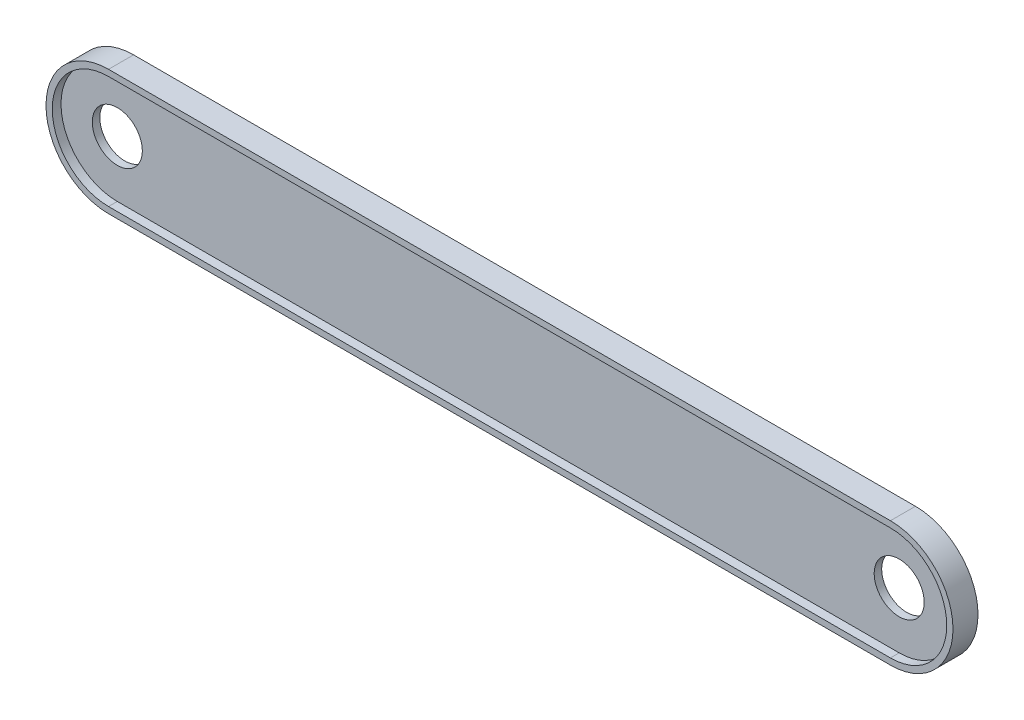
ISO-10303-21;
HEADER;
FILE_DESCRIPTION(('STEP AP214'),'2;1');
FILE_NAME('part.step','',(''),(''),'','','');
FILE_SCHEMA(('AUTOMOTIVE_DESIGN { 1 0 10303 214 1 1 1 1 }'));
ENDSEC;
DATA;
#1=APPLICATION_CONTEXT('core data for automotive mechanical design processes');
#2=APPLICATION_PROTOCOL_DEFINITION('international standard','automotive_design',2000,#1);
#3=PRODUCT_CONTEXT('',#1,'mechanical');
#4=PRODUCT('Part','Part','',(#3));
#5=PRODUCT_RELATED_PRODUCT_CATEGORY('part','',(#4));
#6=PRODUCT_DEFINITION_FORMATION('','',#4);
#7=PRODUCT_DEFINITION_CONTEXT('part definition',#1,'design');
#8=PRODUCT_DEFINITION('design','',#6,#7);
#9=PRODUCT_DEFINITION_SHAPE('','',#8);
#10=(LENGTH_UNIT() NAMED_UNIT(*) SI_UNIT(.MILLI.,.METRE.));
#11=(NAMED_UNIT(*) PLANE_ANGLE_UNIT() SI_UNIT($,.RADIAN.));
#12=(NAMED_UNIT(*) SI_UNIT($,.STERADIAN.) SOLID_ANGLE_UNIT());
#13=UNCERTAINTY_MEASURE_WITH_UNIT(LENGTH_MEASURE(1.E-05),#10,'distance_accuracy_value','');
#14=(GEOMETRIC_REPRESENTATION_CONTEXT(3) GLOBAL_UNCERTAINTY_ASSIGNED_CONTEXT((#13)) GLOBAL_UNIT_ASSIGNED_CONTEXT((#10,
#11,#12)) REPRESENTATION_CONTEXT('',''));
#15=CARTESIAN_POINT('',(0.,0.,0.));
#16=DIRECTION('',(0.,0.,1.));
#17=DIRECTION('',(1.,0.,0.));
#18=AXIS2_PLACEMENT_3D('',#15,#16,#17);
#19=CARTESIAN_POINT('',(312.5,0.,10.));
#20=DIRECTION('',(0.,0.,-1.));
#21=DIRECTION('',(-1.,0.,0.));
#22=AXIS2_PLACEMENT_3D('',#19,#20,#21);
#23=CYLINDRICAL_SURFACE('',#22,20.);
#24=CARTESIAN_POINT('',(312.5,0.,-3.));
#25=DIRECTION('',(0.,0.,-1.));
#26=DIRECTION('',(-1.,0.,0.));
#27=AXIS2_PLACEMENT_3D('',#24,#25,#26);
#28=CIRCLE('',#27,20.);
#29=CARTESIAN_POINT('',(292.5,0.,-3.));
#30=VERTEX_POINT('',#29);
#31=EDGE_CURVE('E202',#30,#30,#28,.T.);
#32=ORIENTED_EDGE('',*,*,#31,.T.);
#33=EDGE_LOOP('',(#32));
#34=FACE_BOUND('',#33,.T.);
#35=CARTESIAN_POINT('',(312.5,0.,3.));
#36=DIRECTION('',(0.,0.,1.));
#37=DIRECTION('',(1.,0.,0.));
#38=AXIS2_PLACEMENT_3D('',#35,#36,#37);
#39=CIRCLE('',#38,20.);
#40=CARTESIAN_POINT('',(332.5,0.,3.));
#41=VERTEX_POINT('',#40);
#42=EDGE_CURVE('E169',#41,#41,#39,.T.);
#43=ORIENTED_EDGE('',*,*,#42,.T.);
#44=EDGE_LOOP('',(#43));
#45=FACE_BOUND('',#44,.T.);
#46=ADVANCED_FACE('F39',(#34,#45),#23,.F.);
#47=CARTESIAN_POINT('',(-312.5,0.,10.));
#48=DIRECTION('',(0.,0.,-1.));
#49=DIRECTION('',(-1.,0.,0.));
#50=AXIS2_PLACEMENT_3D('',#47,#48,#49);
#51=CYLINDRICAL_SURFACE('',#50,20.);
#52=CARTESIAN_POINT('',(-312.5,0.,-3.));
#53=DIRECTION('',(0.,0.,-1.));
#54=DIRECTION('',(-1.,0.,0.));
#55=AXIS2_PLACEMENT_3D('',#52,#53,#54);
#56=CIRCLE('',#55,20.);
#57=CARTESIAN_POINT('',(-332.5,0.,-3.));
#58=VERTEX_POINT('',#57);
#59=EDGE_CURVE('E196',#58,#58,#56,.F.);
#60=ORIENTED_EDGE('',*,*,#59,.F.);
#61=EDGE_LOOP('',(#60));
#62=FACE_BOUND('',#61,.T.);
#63=CARTESIAN_POINT('',(-312.5,0.,3.));
#64=DIRECTION('',(0.,0.,1.));
#65=DIRECTION('',(1.,0.,0.));
#66=AXIS2_PLACEMENT_3D('',#63,#64,#65);
#67=CIRCLE('',#66,20.);
#68=CARTESIAN_POINT('',(-292.5,0.,3.));
#69=VERTEX_POINT('',#68);
#70=EDGE_CURVE('E43',#69,#69,#67,.F.);
#71=ORIENTED_EDGE('',*,*,#70,.F.);
#72=EDGE_LOOP('',(#71));
#73=FACE_BOUND('',#72,.T.);
#74=ADVANCED_FACE('F236',(#62,#73),#51,.F.);
#75=CARTESIAN_POINT('',(0.,0.,10.));
#76=DIRECTION('',(0.,0.,1.));
#77=DIRECTION('',(1.,0.,0.));
#78=AXIS2_PLACEMENT_3D('',#75,#76,#77);
#79=PLANE('',#78);
#80=DIRECTION('',(1.,0.,0.));
#81=VECTOR('',#80,1.);
#82=CARTESIAN_POINT('',(0.,-50.,10.));
#83=LINE('',#82,#81);
#84=CARTESIAN_POINT('',(-312.5,-50.,10.));
#85=VERTEX_POINT('',#84);
#86=CARTESIAN_POINT('',(312.5,-50.,10.));
#87=VERTEX_POINT('',#86);
#88=EDGE_CURVE('E206',#85,#87,#83,.T.);
#89=ORIENTED_EDGE('',*,*,#88,.T.);
#90=CARTESIAN_POINT('',(312.5,0.,10.));
#91=DIRECTION('',(0.,0.,1.));
#92=DIRECTION('',(1.,0.,0.));
#93=AXIS2_PLACEMENT_3D('',#90,#91,#92);
#94=CIRCLE('',#93,50.);
#95=CARTESIAN_POINT('',(312.5,50.,10.));
#96=VERTEX_POINT('',#95);
#97=EDGE_CURVE('E209',#87,#96,#94,.T.);
#98=ORIENTED_EDGE('',*,*,#97,.T.);
#99=DIRECTION('',(1.,0.,0.));
#100=VECTOR('',#99,1.);
#101=CARTESIAN_POINT('',(0.,50.,10.));
#102=LINE('',#101,#100);
#103=CARTESIAN_POINT('',(-312.5,50.,10.));
#104=VERTEX_POINT('',#103);
#105=EDGE_CURVE('E212',#104,#96,#102,.T.);
#106=ORIENTED_EDGE('',*,*,#105,.F.);
#107=CARTESIAN_POINT('',(-312.5,0.,10.));
#108=DIRECTION('',(0.,0.,1.));
#109=DIRECTION('',(1.,0.,0.));
#110=AXIS2_PLACEMENT_3D('',#107,#108,#109);
#111=CIRCLE('',#110,50.);
#112=EDGE_CURVE('E215',#104,#85,#111,.T.);
#113=ORIENTED_EDGE('',*,*,#112,.T.);
#114=EDGE_LOOP('',(#89,#98,#106,#113));
#115=FACE_BOUND('',#114,.T.);
#116=DIRECTION('',(1.,0.,0.));
#117=VECTOR('',#116,1.);
#118=CARTESIAN_POINT('',(-312.5,-45.,10.));
#119=LINE('',#118,#117);
#120=CARTESIAN_POINT('',(-312.5,-45.,10.));
#121=VERTEX_POINT('',#120);
#122=CARTESIAN_POINT('',(312.5,-45.,10.));
#123=VERTEX_POINT('',#122);
#124=EDGE_CURVE('E157',#121,#123,#119,.T.);
#125=ORIENTED_EDGE('',*,*,#124,.F.);
#126=CARTESIAN_POINT('',(-312.5,0.,10.));
#127=DIRECTION('',(0.,0.,-1.));
#128=DIRECTION('',(-1.,0.,0.));
#129=AXIS2_PLACEMENT_3D('',#126,#127,#128);
#130=CIRCLE('',#129,45.);
#131=CARTESIAN_POINT('',(-312.5,45.,10.));
#132=VERTEX_POINT('',#131);
#133=EDGE_CURVE('E56',#121,#132,#130,.T.);
#134=ORIENTED_EDGE('',*,*,#133,.T.);
#135=DIRECTION('',(1.,0.,0.));
#136=VECTOR('',#135,1.);
#137=CARTESIAN_POINT('',(-312.5,45.,10.));
#138=LINE('',#137,#136);
#139=CARTESIAN_POINT('',(312.5,45.,10.));
#140=VERTEX_POINT('',#139);
#141=EDGE_CURVE('E147',#132,#140,#138,.T.);
#142=ORIENTED_EDGE('',*,*,#141,.T.);
#143=CARTESIAN_POINT('',(312.5,0.,10.));
#144=DIRECTION('',(0.,0.,-1.));
#145=DIRECTION('',(-1.,0.,0.));
#146=AXIS2_PLACEMENT_3D('',#143,#144,#145);
#147=CIRCLE('',#146,45.);
#148=EDGE_CURVE('E159',#140,#123,#147,.T.);
#149=ORIENTED_EDGE('',*,*,#148,.T.);
#150=EDGE_LOOP('',(#125,#134,#142,#149));
#151=FACE_BOUND('',#150,.T.);
#152=ADVANCED_FACE('F239',(#115,#151),#79,.T.);
#153=CARTESIAN_POINT('',(0.,-50.,10.));
#154=DIRECTION('',(0.,1.,0.));
#155=DIRECTION('',(0.,0.,1.));
#156=AXIS2_PLACEMENT_3D('',#153,#154,#155);
#157=PLANE('',#156);
#158=DIRECTION('',(1.,0.,0.));
#159=VECTOR('',#158,1.);
#160=CARTESIAN_POINT('',(0.,-50.,-10.));
#161=LINE('',#160,#159);
#162=CARTESIAN_POINT('',(-312.5,-50.,-10.));
#163=VERTEX_POINT('',#162);
#164=CARTESIAN_POINT('',(312.5,-50.,-10.));
#165=VERTEX_POINT('',#164);
#166=EDGE_CURVE('E205',#163,#165,#161,.T.);
#167=ORIENTED_EDGE('',*,*,#166,.T.);
#168=DIRECTION('',(0.,0.,-1.));
#169=VECTOR('',#168,1.);
#170=CARTESIAN_POINT('',(312.5,-50.,10.));
#171=LINE('',#170,#169);
#172=EDGE_CURVE('E11',#87,#165,#171,.T.);
#173=ORIENTED_EDGE('',*,*,#172,.F.);
#174=ORIENTED_EDGE('',*,*,#88,.F.);
#175=DIRECTION('',(0.,0.,-1.));
#176=VECTOR('',#175,1.);
#177=CARTESIAN_POINT('',(-312.5,-50.,10.));
#178=LINE('',#177,#176);
#179=EDGE_CURVE('E217',#85,#163,#178,.T.);
#180=ORIENTED_EDGE('',*,*,#179,.T.);
#181=EDGE_LOOP('',(#167,#173,#174,#180));
#182=FACE_BOUND('',#181,.T.);
#183=ADVANCED_FACE('F41',(#182),#157,.F.);
#184=CARTESIAN_POINT('',(312.5,0.,10.));
#185=DIRECTION('',(0.,0.,-1.));
#186=DIRECTION('',(-1.,0.,0.));
#187=AXIS2_PLACEMENT_3D('',#184,#185,#186);
#188=CYLINDRICAL_SURFACE('',#187,50.);
#189=CARTESIAN_POINT('',(312.5,0.,-10.));
#190=DIRECTION('',(0.,0.,1.));
#191=DIRECTION('',(1.,0.,0.));
#192=AXIS2_PLACEMENT_3D('',#189,#190,#191);
#193=CIRCLE('',#192,50.);
#194=CARTESIAN_POINT('',(312.5,50.,-10.));
#195=VERTEX_POINT('',#194);
#196=EDGE_CURVE('E220',#165,#195,#193,.T.);
#197=ORIENTED_EDGE('',*,*,#196,.T.);
#198=DIRECTION('',(0.,0.,-1.));
#199=VECTOR('',#198,1.);
#200=CARTESIAN_POINT('',(312.5,50.,10.));
#201=LINE('',#200,#199);
#202=EDGE_CURVE('E48',#96,#195,#201,.T.);
#203=ORIENTED_EDGE('',*,*,#202,.F.);
#204=ORIENTED_EDGE('',*,*,#97,.F.);
#205=ORIENTED_EDGE('',*,*,#172,.T.);
#206=EDGE_LOOP('',(#197,#203,#204,#205));
#207=FACE_BOUND('',#206,.T.);
#208=ADVANCED_FACE('F273',(#207),#188,.T.);
#209=CARTESIAN_POINT('',(0.,50.,10.));
#210=DIRECTION('',(0.,1.,0.));
#211=DIRECTION('',(0.,0.,1.));
#212=AXIS2_PLACEMENT_3D('',#209,#210,#211);
#213=PLANE('',#212);
#214=DIRECTION('',(1.,0.,0.));
#215=VECTOR('',#214,1.);
#216=CARTESIAN_POINT('',(0.,50.,-10.));
#217=LINE('',#216,#215);
#218=CARTESIAN_POINT('',(-312.5,50.,-10.));
#219=VERTEX_POINT('',#218);
#220=EDGE_CURVE('E223',#219,#195,#217,.T.);
#221=ORIENTED_EDGE('',*,*,#220,.F.);
#222=DIRECTION('',(0.,0.,-1.));
#223=VECTOR('',#222,1.);
#224=CARTESIAN_POINT('',(-312.5,50.,10.));
#225=LINE('',#224,#223);
#226=EDGE_CURVE('E229',#104,#219,#225,.T.);
#227=ORIENTED_EDGE('',*,*,#226,.F.);
#228=ORIENTED_EDGE('',*,*,#105,.T.);
#229=ORIENTED_EDGE('',*,*,#202,.T.);
#230=EDGE_LOOP('',(#221,#227,#228,#229));
#231=FACE_BOUND('',#230,.T.);
#232=ADVANCED_FACE('F270',(#231),#213,.T.);
#233=CARTESIAN_POINT('',(-312.5,0.,10.));
#234=DIRECTION('',(0.,0.,-1.));
#235=DIRECTION('',(-1.,0.,0.));
#236=AXIS2_PLACEMENT_3D('',#233,#234,#235);
#237=CYLINDRICAL_SURFACE('',#236,50.);
#238=CARTESIAN_POINT('',(-312.5,0.,-10.));
#239=DIRECTION('',(0.,0.,1.));
#240=DIRECTION('',(1.,0.,0.));
#241=AXIS2_PLACEMENT_3D('',#238,#239,#240);
#242=CIRCLE('',#241,50.);
#243=EDGE_CURVE('E210',#219,#163,#242,.T.);
#244=ORIENTED_EDGE('',*,*,#243,.T.);
#245=ORIENTED_EDGE('',*,*,#179,.F.);
#246=ORIENTED_EDGE('',*,*,#112,.F.);
#247=ORIENTED_EDGE('',*,*,#226,.T.);
#248=EDGE_LOOP('',(#244,#245,#246,#247));
#249=FACE_BOUND('',#248,.T.);
#250=ADVANCED_FACE('F266',(#249),#237,.T.);
#251=CARTESIAN_POINT('',(0.,0.,-10.));
#252=DIRECTION('',(0.,0.,1.));
#253=DIRECTION('',(1.,0.,0.));
#254=AXIS2_PLACEMENT_3D('',#251,#252,#253);
#255=PLANE('',#254);
#256=DIRECTION('',(1.,0.,0.));
#257=VECTOR('',#256,1.);
#258=CARTESIAN_POINT('',(-312.5,45.,-10.));
#259=LINE('',#258,#257);
#260=CARTESIAN_POINT('',(-312.5,45.,-10.));
#261=VERTEX_POINT('',#260);
#262=CARTESIAN_POINT('',(312.5,45.,-10.));
#263=VERTEX_POINT('',#262);
#264=EDGE_CURVE('E186',#261,#263,#259,.T.);
#265=ORIENTED_EDGE('',*,*,#264,.F.);
#266=CARTESIAN_POINT('',(-312.5,0.,-10.));
#267=DIRECTION('',(0.,0.,-1.));
#268=DIRECTION('',(-1.,0.,0.));
#269=AXIS2_PLACEMENT_3D('',#266,#267,#268);
#270=CIRCLE('',#269,45.);
#271=CARTESIAN_POINT('',(-312.5,-45.,-10.));
#272=VERTEX_POINT('',#271);
#273=EDGE_CURVE('E64',#272,#261,#270,.T.);
#274=ORIENTED_EDGE('',*,*,#273,.F.);
#275=DIRECTION('',(1.,0.,0.));
#276=VECTOR('',#275,1.);
#277=CARTESIAN_POINT('',(-312.5,-45.,-10.));
#278=LINE('',#277,#276);
#279=CARTESIAN_POINT('',(312.5,-45.,-10.));
#280=VERTEX_POINT('',#279);
#281=EDGE_CURVE('E176',#272,#280,#278,.T.);
#282=ORIENTED_EDGE('',*,*,#281,.T.);
#283=CARTESIAN_POINT('',(312.5,0.,-10.));
#284=DIRECTION('',(0.,0.,-1.));
#285=DIRECTION('',(-1.,0.,0.));
#286=AXIS2_PLACEMENT_3D('',#283,#284,#285);
#287=CIRCLE('',#286,45.);
#288=EDGE_CURVE('E189',#263,#280,#287,.T.);
#289=ORIENTED_EDGE('',*,*,#288,.F.);
#290=EDGE_LOOP('',(#265,#274,#282,#289));
#291=FACE_BOUND('',#290,.T.);
#292=ORIENTED_EDGE('',*,*,#166,.F.);
#293=ORIENTED_EDGE('',*,*,#243,.F.);
#294=ORIENTED_EDGE('',*,*,#220,.T.);
#295=ORIENTED_EDGE('',*,*,#196,.F.);
#296=EDGE_LOOP('',(#292,#293,#294,#295));
#297=FACE_BOUND('',#296,.T.);
#298=ADVANCED_FACE('F269',(#291,#297),#255,.F.);
#299=CARTESIAN_POINT('',(-312.5,0.,-3.));
#300=DIRECTION('',(0.,0.,-1.));
#301=DIRECTION('',(-1.,0.,0.));
#302=AXIS2_PLACEMENT_3D('',#299,#300,#301);
#303=PLANE('',#302);
#304=ORIENTED_EDGE('',*,*,#31,.F.);
#305=EDGE_LOOP('',(#304));
#306=FACE_BOUND('',#305,.T.);
#307=CARTESIAN_POINT('',(-312.5,0.,-3.));
#308=DIRECTION('',(0.,0.,-1.));
#309=DIRECTION('',(-1.,0.,0.));
#310=AXIS2_PLACEMENT_3D('',#307,#308,#309);
#311=CIRCLE('',#310,45.);
#312=CARTESIAN_POINT('',(-312.5,-45.,-3.));
#313=VERTEX_POINT('',#312);
#314=CARTESIAN_POINT('',(-312.5,45.,-3.));
#315=VERTEX_POINT('',#314);
#316=EDGE_CURVE('E172',#313,#315,#311,.T.);
#317=ORIENTED_EDGE('',*,*,#316,.T.);
#318=DIRECTION('',(1.,0.,0.));
#319=VECTOR('',#318,1.);
#320=CARTESIAN_POINT('',(-312.5,45.,-3.));
#321=LINE('',#320,#319);
#322=CARTESIAN_POINT('',(312.5,45.,-3.));
#323=VERTEX_POINT('',#322);
#324=EDGE_CURVE('E175',#315,#323,#321,.T.);
#325=ORIENTED_EDGE('',*,*,#324,.T.);
#326=CARTESIAN_POINT('',(312.5,0.,-3.));
#327=DIRECTION('',(0.,0.,-1.));
#328=DIRECTION('',(-1.,0.,0.));
#329=AXIS2_PLACEMENT_3D('',#326,#327,#328);
#330=CIRCLE('',#329,45.);
#331=CARTESIAN_POINT('',(312.5,-45.,-3.));
#332=VERTEX_POINT('',#331);
#333=EDGE_CURVE('E179',#323,#332,#330,.T.);
#334=ORIENTED_EDGE('',*,*,#333,.T.);
#335=DIRECTION('',(1.,0.,0.));
#336=VECTOR('',#335,1.);
#337=CARTESIAN_POINT('',(-312.5,-45.,-3.));
#338=LINE('',#337,#336);
#339=EDGE_CURVE('E182',#313,#332,#338,.T.);
#340=ORIENTED_EDGE('',*,*,#339,.F.);
#341=EDGE_LOOP('',(#317,#325,#334,#340));
#342=FACE_BOUND('',#341,.T.);
#343=ORIENTED_EDGE('',*,*,#59,.T.);
#344=EDGE_LOOP('',(#343));
#345=FACE_BOUND('',#344,.T.);
#346=ADVANCED_FACE('F234',(#306,#342,#345),#303,.T.);
#347=CARTESIAN_POINT('',(-312.5,0.,-3.));
#348=DIRECTION('',(0.,0.,-1.));
#349=DIRECTION('',(-1.,0.,0.));
#350=AXIS2_PLACEMENT_3D('',#347,#348,#349);
#351=CYLINDRICAL_SURFACE('',#350,45.);
#352=ORIENTED_EDGE('',*,*,#273,.T.);
#353=DIRECTION('',(0.,0.,-1.));
#354=VECTOR('',#353,1.);
#355=CARTESIAN_POINT('',(-312.5,45.,-3.));
#356=LINE('',#355,#354);
#357=EDGE_CURVE('E184',#315,#261,#356,.T.);
#358=ORIENTED_EDGE('',*,*,#357,.F.);
#359=ORIENTED_EDGE('',*,*,#316,.F.);
#360=DIRECTION('',(0.,0.,-1.));
#361=VECTOR('',#360,1.);
#362=CARTESIAN_POINT('',(-312.5,-45.,-3.));
#363=LINE('',#362,#361);
#364=EDGE_CURVE('E194',#313,#272,#363,.T.);
#365=ORIENTED_EDGE('',*,*,#364,.T.);
#366=EDGE_LOOP('',(#352,#358,#359,#365));
#367=FACE_BOUND('',#366,.T.);
#368=ADVANCED_FACE('F310',(#367),#351,.F.);
#369=CARTESIAN_POINT('',(-312.5,-45.,-3.));
#370=DIRECTION('',(0.,1.,0.));
#371=DIRECTION('',(0.,0.,1.));
#372=AXIS2_PLACEMENT_3D('',#369,#370,#371);
#373=PLANE('',#372);
#374=ORIENTED_EDGE('',*,*,#281,.F.);
#375=ORIENTED_EDGE('',*,*,#364,.F.);
#376=ORIENTED_EDGE('',*,*,#339,.T.);
#377=DIRECTION('',(0.,0.,-1.));
#378=VECTOR('',#377,1.);
#379=CARTESIAN_POINT('',(312.5,-45.,-3.));
#380=LINE('',#379,#378);
#381=EDGE_CURVE('E197',#332,#280,#380,.T.);
#382=ORIENTED_EDGE('',*,*,#381,.T.);
#383=EDGE_LOOP('',(#374,#375,#376,#382));
#384=FACE_BOUND('',#383,.T.);
#385=ADVANCED_FACE('F312',(#384),#373,.T.);
#386=CARTESIAN_POINT('',(312.5,0.,-3.));
#387=DIRECTION('',(0.,0.,-1.));
#388=DIRECTION('',(-1.,0.,0.));
#389=AXIS2_PLACEMENT_3D('',#386,#387,#388);
#390=CYLINDRICAL_SURFACE('',#389,45.);
#391=ORIENTED_EDGE('',*,*,#288,.T.);
#392=ORIENTED_EDGE('',*,*,#381,.F.);
#393=ORIENTED_EDGE('',*,*,#333,.F.);
#394=DIRECTION('',(0.,0.,-1.));
#395=VECTOR('',#394,1.);
#396=CARTESIAN_POINT('',(312.5,45.,-3.));
#397=LINE('',#396,#395);
#398=EDGE_CURVE('E199',#323,#263,#397,.T.);
#399=ORIENTED_EDGE('',*,*,#398,.T.);
#400=EDGE_LOOP('',(#391,#392,#393,#399));
#401=FACE_BOUND('',#400,.T.);
#402=ADVANCED_FACE('F253',(#401),#390,.F.);
#403=CARTESIAN_POINT('',(-312.5,45.,-3.));
#404=DIRECTION('',(0.,1.,0.));
#405=DIRECTION('',(0.,0.,1.));
#406=AXIS2_PLACEMENT_3D('',#403,#404,#405);
#407=PLANE('',#406);
#408=ORIENTED_EDGE('',*,*,#264,.T.);
#409=ORIENTED_EDGE('',*,*,#398,.F.);
#410=ORIENTED_EDGE('',*,*,#324,.F.);
#411=ORIENTED_EDGE('',*,*,#357,.T.);
#412=EDGE_LOOP('',(#408,#409,#410,#411));
#413=FACE_BOUND('',#412,.T.);
#414=ADVANCED_FACE('F244',(#413),#407,.F.);
#415=CARTESIAN_POINT('',(-312.5,0.,3.));
#416=DIRECTION('',(0.,0.,1.));
#417=DIRECTION('',(-1.,0.,0.));
#418=AXIS2_PLACEMENT_3D('',#415,#416,#417);
#419=PLANE('',#418);
#420=ORIENTED_EDGE('',*,*,#42,.F.);
#421=EDGE_LOOP('',(#420));
#422=FACE_BOUND('',#421,.T.);
#423=CARTESIAN_POINT('',(-312.5,0.,3.));
#424=DIRECTION('',(0.,0.,-1.));
#425=DIRECTION('',(-1.,0.,0.));
#426=AXIS2_PLACEMENT_3D('',#423,#424,#425);
#427=CIRCLE('',#426,45.);
#428=CARTESIAN_POINT('',(-312.5,-45.,3.));
#429=VERTEX_POINT('',#428);
#430=CARTESIAN_POINT('',(-312.5,45.,3.));
#431=VERTEX_POINT('',#430);
#432=EDGE_CURVE('E132',#429,#431,#427,.T.);
#433=ORIENTED_EDGE('',*,*,#432,.F.);
#434=DIRECTION('',(1.,0.,0.));
#435=VECTOR('',#434,1.);
#436=CARTESIAN_POINT('',(-312.5,-45.,3.));
#437=LINE('',#436,#435);
#438=CARTESIAN_POINT('',(312.5,-45.,3.));
#439=VERTEX_POINT('',#438);
#440=EDGE_CURVE('E146',#429,#439,#437,.T.);
#441=ORIENTED_EDGE('',*,*,#440,.T.);
#442=CARTESIAN_POINT('',(312.5,0.,3.));
#443=DIRECTION('',(0.,0.,-1.));
#444=DIRECTION('',(-1.,0.,0.));
#445=AXIS2_PLACEMENT_3D('',#442,#443,#444);
#446=CIRCLE('',#445,45.);
#447=CARTESIAN_POINT('',(312.5,45.,3.));
#448=VERTEX_POINT('',#447);
#449=EDGE_CURVE('E151',#448,#439,#446,.T.);
#450=ORIENTED_EDGE('',*,*,#449,.F.);
#451=DIRECTION('',(1.,0.,0.));
#452=VECTOR('',#451,1.);
#453=CARTESIAN_POINT('',(-312.5,45.,3.));
#454=LINE('',#453,#452);
#455=EDGE_CURVE('E139',#431,#448,#454,.T.);
#456=ORIENTED_EDGE('',*,*,#455,.F.);
#457=EDGE_LOOP('',(#433,#441,#450,#456));
#458=FACE_BOUND('',#457,.T.);
#459=ORIENTED_EDGE('',*,*,#70,.T.);
#460=EDGE_LOOP('',(#459));
#461=FACE_BOUND('',#460,.T.);
#462=ADVANCED_FACE('F143',(#422,#458,#461),#419,.T.);
#463=CARTESIAN_POINT('',(-312.5,0.,3.));
#464=DIRECTION('',(0.,0.,1.));
#465=DIRECTION('',(1.,0.,0.));
#466=AXIS2_PLACEMENT_3D('',#463,#464,#465);
#467=CYLINDRICAL_SURFACE('',#466,45.);
#468=ORIENTED_EDGE('',*,*,#133,.F.);
#469=DIRECTION('',(0.,0.,1.));
#470=VECTOR('',#469,1.);
#471=CARTESIAN_POINT('',(-312.5,-45.,3.));
#472=LINE('',#471,#470);
#473=EDGE_CURVE('E129',#429,#121,#472,.T.);
#474=ORIENTED_EDGE('',*,*,#473,.F.);
#475=ORIENTED_EDGE('',*,*,#432,.T.);
#476=DIRECTION('',(0.,0.,1.));
#477=VECTOR('',#476,1.);
#478=CARTESIAN_POINT('',(-312.5,45.,3.));
#479=LINE('',#478,#477);
#480=EDGE_CURVE('E164',#431,#132,#479,.T.);
#481=ORIENTED_EDGE('',*,*,#480,.T.);
#482=EDGE_LOOP('',(#468,#474,#475,#481));
#483=FACE_BOUND('',#482,.T.);
#484=ADVANCED_FACE('F131',(#483),#467,.F.);
#485=CARTESIAN_POINT('',(-312.5,45.,3.));
#486=DIRECTION('',(0.,-1.,0.));
#487=DIRECTION('',(0.,0.,-1.));
#488=AXIS2_PLACEMENT_3D('',#485,#486,#487);
#489=PLANE('',#488);
#490=ORIENTED_EDGE('',*,*,#141,.F.);
#491=ORIENTED_EDGE('',*,*,#480,.F.);
#492=ORIENTED_EDGE('',*,*,#455,.T.);
#493=DIRECTION('',(0.,0.,1.));
#494=VECTOR('',#493,1.);
#495=CARTESIAN_POINT('',(312.5,45.,3.));
#496=LINE('',#495,#494);
#497=EDGE_CURVE('E166',#448,#140,#496,.T.);
#498=ORIENTED_EDGE('',*,*,#497,.T.);
#499=EDGE_LOOP('',(#490,#491,#492,#498));
#500=FACE_BOUND('',#499,.T.);
#501=ADVANCED_FACE('F251',(#500),#489,.T.);
#502=CARTESIAN_POINT('',(312.5,0.,3.));
#503=DIRECTION('',(0.,0.,1.));
#504=DIRECTION('',(1.,0.,0.));
#505=AXIS2_PLACEMENT_3D('',#502,#503,#504);
#506=CYLINDRICAL_SURFACE('',#505,45.);
#507=ORIENTED_EDGE('',*,*,#148,.F.);
#508=ORIENTED_EDGE('',*,*,#497,.F.);
#509=ORIENTED_EDGE('',*,*,#449,.T.);
#510=DIRECTION('',(0.,0.,1.));
#511=VECTOR('',#510,1.);
#512=CARTESIAN_POINT('',(312.5,-45.,3.));
#513=LINE('',#512,#511);
#514=EDGE_CURVE('E138',#439,#123,#513,.T.);
#515=ORIENTED_EDGE('',*,*,#514,.T.);
#516=EDGE_LOOP('',(#507,#508,#509,#515));
#517=FACE_BOUND('',#516,.T.);
#518=ADVANCED_FACE('F298',(#517),#506,.F.);
#519=CARTESIAN_POINT('',(-312.5,-45.,3.));
#520=DIRECTION('',(0.,-1.,0.));
#521=DIRECTION('',(0.,0.,-1.));
#522=AXIS2_PLACEMENT_3D('',#519,#520,#521);
#523=PLANE('',#522);
#524=ORIENTED_EDGE('',*,*,#124,.T.);
#525=ORIENTED_EDGE('',*,*,#514,.F.);
#526=ORIENTED_EDGE('',*,*,#440,.F.);
#527=ORIENTED_EDGE('',*,*,#473,.T.);
#528=EDGE_LOOP('',(#524,#525,#526,#527));
#529=FACE_BOUND('',#528,.T.);
#530=ADVANCED_FACE('F150',(#529),#523,.F.);
#531=CLOSED_SHELL('',(#46,#74,#152,#183,#208,#232,#250,#298,#346,#368,#385,#402,#414,#462,#484,
#501,#518,#530));
#532=MANIFOLD_SOLID_BREP('B2',#531);
#533=ADVANCED_BREP_SHAPE_REPRESENTATION('',(#18,#532),#14);
#534=SHAPE_DEFINITION_REPRESENTATION(#9,#533);
ENDSEC;
END-ISO-10303-21;
